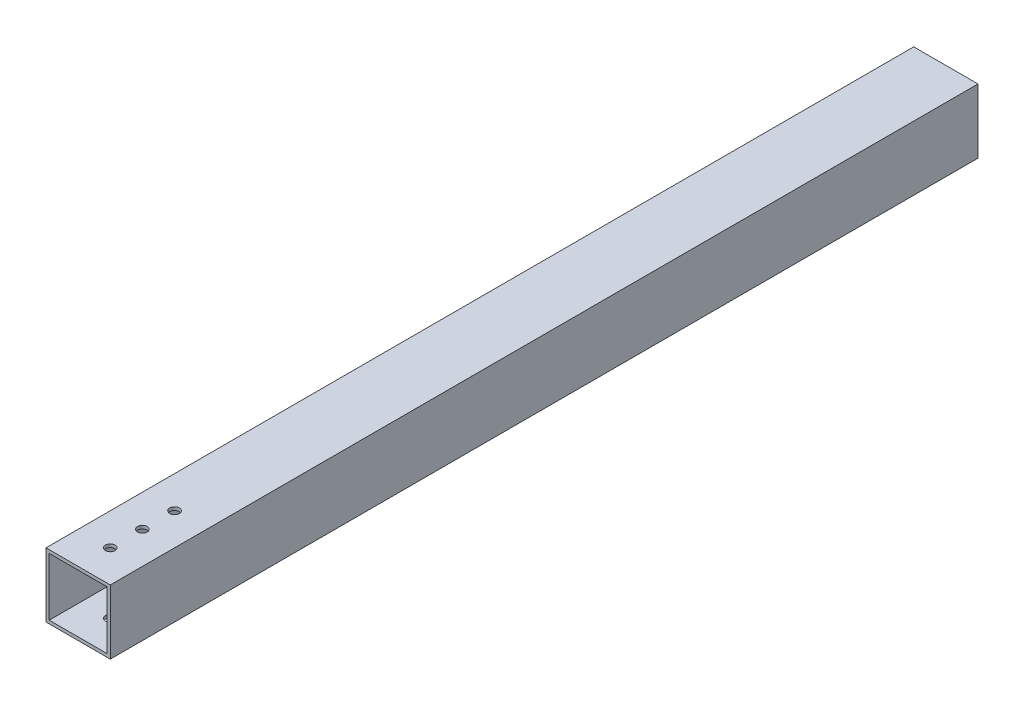
ISO-10303-21;
HEADER;
FILE_DESCRIPTION(('STEP AP214'),'2;1');
FILE_NAME('part.step','',(''),(''),'','','');
FILE_SCHEMA(('AUTOMOTIVE_DESIGN { 1 0 10303 214 1 1 1 1 }'));
ENDSEC;
DATA;
#1=APPLICATION_CONTEXT('core data for automotive mechanical design processes');
#2=APPLICATION_PROTOCOL_DEFINITION('international standard','automotive_design',2000,#1);
#3=PRODUCT_CONTEXT('',#1,'mechanical');
#4=PRODUCT('Part','Part','',(#3));
#5=PRODUCT_RELATED_PRODUCT_CATEGORY('part','',(#4));
#6=PRODUCT_DEFINITION_FORMATION('','',#4);
#7=PRODUCT_DEFINITION_CONTEXT('part definition',#1,'design');
#8=PRODUCT_DEFINITION('design','',#6,#7);
#9=PRODUCT_DEFINITION_SHAPE('','',#8);
#10=(LENGTH_UNIT() NAMED_UNIT(*) SI_UNIT(.MILLI.,.METRE.));
#11=(NAMED_UNIT(*) PLANE_ANGLE_UNIT() SI_UNIT($,.RADIAN.));
#12=(NAMED_UNIT(*) SI_UNIT($,.STERADIAN.) SOLID_ANGLE_UNIT());
#13=UNCERTAINTY_MEASURE_WITH_UNIT(LENGTH_MEASURE(1.E-05),#10,'distance_accuracy_value','');
#14=(GEOMETRIC_REPRESENTATION_CONTEXT(3) GLOBAL_UNCERTAINTY_ASSIGNED_CONTEXT((#13)) GLOBAL_UNIT_ASSIGNED_CONTEXT((#10,
#11,#12)) REPRESENTATION_CONTEXT('',''));
#15=CARTESIAN_POINT('',(0.,0.,0.));
#16=DIRECTION('',(0.,0.,1.));
#17=DIRECTION('',(1.,0.,0.));
#18=AXIS2_PLACEMENT_3D('',#15,#16,#17);
#19=CARTESIAN_POINT('',(0.,0.,135.));
#20=DIRECTION('',(0.,0.,1.));
#21=DIRECTION('',(1.,0.,0.));
#22=AXIS2_PLACEMENT_3D('',#19,#20,#21);
#23=PLANE('',#22);
#24=DIRECTION('',(0.,1.,0.));
#25=VECTOR('',#24,1.);
#26=CARTESIAN_POINT('',(10.,10.,135.));
#27=LINE('',#26,#25);
#28=CARTESIAN_POINT('',(10.,-10.,135.));
#29=VERTEX_POINT('',#28);
#30=CARTESIAN_POINT('',(10.,10.,135.));
#31=VERTEX_POINT('',#30);
#32=EDGE_CURVE('E163',#29,#31,#27,.T.);
#33=ORIENTED_EDGE('',*,*,#32,.T.);
#34=DIRECTION('',(-1.,0.,0.));
#35=VECTOR('',#34,1.);
#36=CARTESIAN_POINT('',(-10.,10.,135.));
#37=LINE('',#36,#35);
#38=CARTESIAN_POINT('',(-10.,10.,135.));
#39=VERTEX_POINT('',#38);
#40=EDGE_CURVE('E167',#31,#39,#37,.T.);
#41=ORIENTED_EDGE('',*,*,#40,.T.);
#42=DIRECTION('',(0.,-1.,0.));
#43=VECTOR('',#42,1.);
#44=CARTESIAN_POINT('',(-10.,10.,135.));
#45=LINE('',#44,#43);
#46=CARTESIAN_POINT('',(-10.,-10.,135.));
#47=VERTEX_POINT('',#46);
#48=EDGE_CURVE('E171',#39,#47,#45,.T.);
#49=ORIENTED_EDGE('',*,*,#48,.T.);
#50=DIRECTION('',(1.,0.,0.));
#51=VECTOR('',#50,1.);
#52=CARTESIAN_POINT('',(-10.,-10.,135.));
#53=LINE('',#52,#51);
#54=EDGE_CURVE('E174',#47,#29,#53,.T.);
#55=ORIENTED_EDGE('',*,*,#54,.T.);
#56=EDGE_LOOP('',(#33,#41,#49,#55));
#57=FACE_BOUND('',#56,.T.);
#58=DIRECTION('',(-1.,0.,0.));
#59=VECTOR('',#58,1.);
#60=CARTESIAN_POINT('',(-9.,9.,135.));
#61=LINE('',#60,#59);
#62=CARTESIAN_POINT('',(9.,9.,135.));
#63=VERTEX_POINT('',#62);
#64=CARTESIAN_POINT('',(-9.,9.,135.));
#65=VERTEX_POINT('',#64);
#66=EDGE_CURVE('E122',#63,#65,#61,.T.);
#67=ORIENTED_EDGE('',*,*,#66,.F.);
#68=DIRECTION('',(0.,1.,0.));
#69=VECTOR('',#68,1.);
#70=CARTESIAN_POINT('',(9.,9.,135.));
#71=LINE('',#70,#69);
#72=CARTESIAN_POINT('',(9.,-9.,135.));
#73=VERTEX_POINT('',#72);
#74=EDGE_CURVE('E113',#73,#63,#71,.T.);
#75=ORIENTED_EDGE('',*,*,#74,.F.);
#76=DIRECTION('',(1.,0.,0.));
#77=VECTOR('',#76,1.);
#78=CARTESIAN_POINT('',(-9.,-9.,135.));
#79=LINE('',#78,#77);
#80=CARTESIAN_POINT('',(-9.,-9.,135.));
#81=VERTEX_POINT('',#80);
#82=EDGE_CURVE('E139',#81,#73,#79,.T.);
#83=ORIENTED_EDGE('',*,*,#82,.F.);
#84=DIRECTION('',(0.,-1.,0.));
#85=VECTOR('',#84,1.);
#86=CARTESIAN_POINT('',(-9.,9.,135.));
#87=LINE('',#86,#85);
#88=EDGE_CURVE('E135',#65,#81,#87,.T.);
#89=ORIENTED_EDGE('',*,*,#88,.F.);
#90=EDGE_LOOP('',(#67,#75,#83,#89));
#91=FACE_BOUND('',#90,.T.);
#92=ADVANCED_FACE('F45',(#57,#91),#23,.T.);
#93=CARTESIAN_POINT('',(0.,0.,-135.));
#94=DIRECTION('',(0.,0.,1.));
#95=DIRECTION('',(1.,0.,0.));
#96=AXIS2_PLACEMENT_3D('',#93,#94,#95);
#97=PLANE('',#96);
#98=DIRECTION('',(0.,1.,0.));
#99=VECTOR('',#98,1.);
#100=CARTESIAN_POINT('',(10.,10.,-135.));
#101=LINE('',#100,#99);
#102=CARTESIAN_POINT('',(10.,-10.,-135.));
#103=VERTEX_POINT('',#102);
#104=CARTESIAN_POINT('',(10.,10.,-135.));
#105=VERTEX_POINT('',#104);
#106=EDGE_CURVE('E131',#103,#105,#101,.T.);
#107=ORIENTED_EDGE('',*,*,#106,.F.);
#108=DIRECTION('',(1.,0.,0.));
#109=VECTOR('',#108,1.);
#110=CARTESIAN_POINT('',(-10.,-10.,-135.));
#111=LINE('',#110,#109);
#112=CARTESIAN_POINT('',(-10.,-10.,-135.));
#113=VERTEX_POINT('',#112);
#114=EDGE_CURVE('E168',#113,#103,#111,.T.);
#115=ORIENTED_EDGE('',*,*,#114,.F.);
#116=DIRECTION('',(0.,-1.,0.));
#117=VECTOR('',#116,1.);
#118=CARTESIAN_POINT('',(-10.,10.,-135.));
#119=LINE('',#118,#117);
#120=CARTESIAN_POINT('',(-10.,10.,-135.));
#121=VERTEX_POINT('',#120);
#122=EDGE_CURVE('E184',#121,#113,#119,.T.);
#123=ORIENTED_EDGE('',*,*,#122,.F.);
#124=DIRECTION('',(-1.,0.,0.));
#125=VECTOR('',#124,1.);
#126=CARTESIAN_POINT('',(-10.,10.,-135.));
#127=LINE('',#126,#125);
#128=EDGE_CURVE('E181',#105,#121,#127,.T.);
#129=ORIENTED_EDGE('',*,*,#128,.F.);
#130=EDGE_LOOP('',(#107,#115,#123,#129));
#131=FACE_BOUND('',#130,.T.);
#132=DIRECTION('',(0.,1.,0.));
#133=VECTOR('',#132,1.);
#134=CARTESIAN_POINT('',(9.,9.,-135.));
#135=LINE('',#134,#133);
#136=CARTESIAN_POINT('',(9.,-9.,-135.));
#137=VERTEX_POINT('',#136);
#138=CARTESIAN_POINT('',(9.,9.,-135.));
#139=VERTEX_POINT('',#138);
#140=EDGE_CURVE('E71',#137,#139,#135,.T.);
#141=ORIENTED_EDGE('',*,*,#140,.T.);
#142=DIRECTION('',(-1.,0.,0.));
#143=VECTOR('',#142,1.);
#144=CARTESIAN_POINT('',(-9.,9.,-135.));
#145=LINE('',#144,#143);
#146=CARTESIAN_POINT('',(-9.,9.,-135.));
#147=VERTEX_POINT('',#146);
#148=EDGE_CURVE('E129',#139,#147,#145,.T.);
#149=ORIENTED_EDGE('',*,*,#148,.T.);
#150=DIRECTION('',(0.,-1.,0.));
#151=VECTOR('',#150,1.);
#152=CARTESIAN_POINT('',(-9.,9.,-135.));
#153=LINE('',#152,#151);
#154=CARTESIAN_POINT('',(-9.,-9.,-135.));
#155=VERTEX_POINT('',#154);
#156=EDGE_CURVE('E150',#147,#155,#153,.T.);
#157=ORIENTED_EDGE('',*,*,#156,.T.);
#158=DIRECTION('',(1.,0.,0.));
#159=VECTOR('',#158,1.);
#160=CARTESIAN_POINT('',(-9.,-9.,-135.));
#161=LINE('',#160,#159);
#162=EDGE_CURVE('E123',#155,#137,#161,.T.);
#163=ORIENTED_EDGE('',*,*,#162,.T.);
#164=EDGE_LOOP('',(#141,#149,#157,#163));
#165=FACE_BOUND('',#164,.T.);
#166=ADVANCED_FACE('F258',(#131,#165),#97,.F.);
#167=CARTESIAN_POINT('',(10.,10.,135.));
#168=DIRECTION('',(-1.,0.,0.));
#169=DIRECTION('',(0.,0.,1.));
#170=AXIS2_PLACEMENT_3D('',#167,#168,#169);
#171=PLANE('',#170);
#172=ORIENTED_EDGE('',*,*,#106,.T.);
#173=DIRECTION('',(0.,0.,-1.));
#174=VECTOR('',#173,1.);
#175=CARTESIAN_POINT('',(10.,10.,135.));
#176=LINE('',#175,#174);
#177=EDGE_CURVE('E11',#31,#105,#176,.T.);
#178=ORIENTED_EDGE('',*,*,#177,.F.);
#179=ORIENTED_EDGE('',*,*,#32,.F.);
#180=DIRECTION('',(0.,0.,-1.));
#181=VECTOR('',#180,1.);
#182=CARTESIAN_POINT('',(10.,-10.,135.));
#183=LINE('',#182,#181);
#184=EDGE_CURVE('E177',#29,#103,#183,.T.);
#185=ORIENTED_EDGE('',*,*,#184,.T.);
#186=EDGE_LOOP('',(#172,#178,#179,#185));
#187=FACE_BOUND('',#186,.T.);
#188=ADVANCED_FACE('F47',(#187),#171,.F.);
#189=CARTESIAN_POINT('',(-10.,10.,135.));
#190=DIRECTION('',(0.,-1.,0.));
#191=DIRECTION('',(0.,0.,-1.));
#192=AXIS2_PLACEMENT_3D('',#189,#190,#191);
#193=PLANE('',#192);
#194=CARTESIAN_POINT('',(0.,10.,125.));
#195=DIRECTION('',(0.,1.,0.));
#196=DIRECTION('',(0.,0.,1.));
#197=AXIS2_PLACEMENT_3D('',#194,#195,#196);
#198=CIRCLE('',#197,1.5);
#199=CARTESIAN_POINT('',(0.,10.,126.5));
#200=VERTEX_POINT('',#199);
#201=EDGE_CURVE('E203',#200,#200,#198,.T.);
#202=ORIENTED_EDGE('',*,*,#201,.F.);
#203=EDGE_LOOP('',(#202));
#204=FACE_BOUND('',#203,.T.);
#205=CARTESIAN_POINT('',(0.,10.,115.));
#206=DIRECTION('',(0.,1.,0.));
#207=DIRECTION('',(0.,0.,1.));
#208=AXIS2_PLACEMENT_3D('',#205,#206,#207);
#209=CIRCLE('',#208,1.5);
#210=CARTESIAN_POINT('',(0.,10.,116.5));
#211=VERTEX_POINT('',#210);
#212=EDGE_CURVE('E288',#211,#211,#209,.T.);
#213=ORIENTED_EDGE('',*,*,#212,.F.);
#214=EDGE_LOOP('',(#213));
#215=FACE_BOUND('',#214,.T.);
#216=CARTESIAN_POINT('',(0.,10.,105.));
#217=DIRECTION('',(0.,1.,0.));
#218=DIRECTION('',(0.,0.,1.));
#219=AXIS2_PLACEMENT_3D('',#216,#217,#218);
#220=CIRCLE('',#219,1.5);
#221=CARTESIAN_POINT('',(0.,10.,106.5));
#222=VERTEX_POINT('',#221);
#223=EDGE_CURVE('E292',#222,#222,#220,.T.);
#224=ORIENTED_EDGE('',*,*,#223,.F.);
#225=EDGE_LOOP('',(#224));
#226=FACE_BOUND('',#225,.T.);
#227=ORIENTED_EDGE('',*,*,#128,.T.);
#228=DIRECTION('',(0.,0.,-1.));
#229=VECTOR('',#228,1.);
#230=CARTESIAN_POINT('',(-10.,10.,135.));
#231=LINE('',#230,#229);
#232=EDGE_CURVE('E55',#39,#121,#231,.T.);
#233=ORIENTED_EDGE('',*,*,#232,.F.);
#234=ORIENTED_EDGE('',*,*,#40,.F.);
#235=ORIENTED_EDGE('',*,*,#177,.T.);
#236=EDGE_LOOP('',(#227,#233,#234,#235));
#237=FACE_BOUND('',#236,.T.);
#238=ADVANCED_FACE('F273',(#204,#215,#226,#237),#193,.F.);
#239=CARTESIAN_POINT('',(-10.,10.,135.));
#240=DIRECTION('',(1.,0.,0.));
#241=DIRECTION('',(0.,0.,-1.));
#242=AXIS2_PLACEMENT_3D('',#239,#240,#241);
#243=PLANE('',#242);
#244=ORIENTED_EDGE('',*,*,#122,.T.);
#245=DIRECTION('',(0.,0.,-1.));
#246=VECTOR('',#245,1.);
#247=CARTESIAN_POINT('',(-10.,-10.,135.));
#248=LINE('',#247,#246);
#249=EDGE_CURVE('E192',#47,#113,#248,.T.);
#250=ORIENTED_EDGE('',*,*,#249,.F.);
#251=ORIENTED_EDGE('',*,*,#48,.F.);
#252=ORIENTED_EDGE('',*,*,#232,.T.);
#253=EDGE_LOOP('',(#244,#250,#251,#252));
#254=FACE_BOUND('',#253,.T.);
#255=ADVANCED_FACE('F271',(#254),#243,.F.);
#256=CARTESIAN_POINT('',(-10.,-10.,135.));
#257=DIRECTION('',(0.,1.,0.));
#258=DIRECTION('',(0.,0.,1.));
#259=AXIS2_PLACEMENT_3D('',#256,#257,#258);
#260=PLANE('',#259);
#261=CARTESIAN_POINT('',(0.,-9.99999999999999,125.));
#262=DIRECTION('',(0.,1.,0.));
#263=DIRECTION('',(0.,0.,1.));
#264=AXIS2_PLACEMENT_3D('',#261,#262,#263);
#265=CIRCLE('',#264,1.5);
#266=CARTESIAN_POINT('',(0.,-9.99999999999999,126.5));
#267=VERTEX_POINT('',#266);
#268=EDGE_CURVE('E147',#267,#267,#265,.T.);
#269=ORIENTED_EDGE('',*,*,#268,.T.);
#270=EDGE_LOOP('',(#269));
#271=FACE_BOUND('',#270,.T.);
#272=CARTESIAN_POINT('',(0.,-9.99999999999999,115.));
#273=DIRECTION('',(0.,1.,0.));
#274=DIRECTION('',(0.,0.,1.));
#275=AXIS2_PLACEMENT_3D('',#272,#273,#274);
#276=CIRCLE('',#275,1.5);
#277=CARTESIAN_POINT('',(0.,-9.99999999999999,116.5));
#278=VERTEX_POINT('',#277);
#279=EDGE_CURVE('E214',#278,#278,#276,.T.);
#280=ORIENTED_EDGE('',*,*,#279,.T.);
#281=EDGE_LOOP('',(#280));
#282=FACE_BOUND('',#281,.T.);
#283=CARTESIAN_POINT('',(0.,-9.99999999999999,105.));
#284=DIRECTION('',(0.,1.,0.));
#285=DIRECTION('',(0.,0.,1.));
#286=AXIS2_PLACEMENT_3D('',#283,#284,#285);
#287=CIRCLE('',#286,1.5);
#288=CARTESIAN_POINT('',(0.,-9.99999999999999,106.5));
#289=VERTEX_POINT('',#288);
#290=EDGE_CURVE('E208',#289,#289,#287,.T.);
#291=ORIENTED_EDGE('',*,*,#290,.T.);
#292=EDGE_LOOP('',(#291));
#293=FACE_BOUND('',#292,.T.);
#294=ORIENTED_EDGE('',*,*,#114,.T.);
#295=ORIENTED_EDGE('',*,*,#184,.F.);
#296=ORIENTED_EDGE('',*,*,#54,.F.);
#297=ORIENTED_EDGE('',*,*,#249,.T.);
#298=EDGE_LOOP('',(#294,#295,#296,#297));
#299=FACE_BOUND('',#298,.T.);
#300=ADVANCED_FACE('F235',(#271,#282,#293,#299),#260,.F.);
#301=CARTESIAN_POINT('',(9.,9.,135.));
#302=DIRECTION('',(-1.,0.,0.));
#303=DIRECTION('',(0.,0.,1.));
#304=AXIS2_PLACEMENT_3D('',#301,#302,#303);
#305=PLANE('',#304);
#306=ORIENTED_EDGE('',*,*,#140,.F.);
#307=DIRECTION('',(0.,0.,-1.));
#308=VECTOR('',#307,1.);
#309=CARTESIAN_POINT('',(9.,-9.,135.));
#310=LINE('',#309,#308);
#311=EDGE_CURVE('E117',#73,#137,#310,.T.);
#312=ORIENTED_EDGE('',*,*,#311,.F.);
#313=ORIENTED_EDGE('',*,*,#74,.T.);
#314=DIRECTION('',(0.,0.,-1.));
#315=VECTOR('',#314,1.);
#316=CARTESIAN_POINT('',(9.,9.,135.));
#317=LINE('',#316,#315);
#318=EDGE_CURVE('E116',#63,#139,#317,.T.);
#319=ORIENTED_EDGE('',*,*,#318,.T.);
#320=EDGE_LOOP('',(#306,#312,#313,#319));
#321=FACE_BOUND('',#320,.T.);
#322=ADVANCED_FACE('F115',(#321),#305,.T.);
#323=CARTESIAN_POINT('',(-9.,9.,135.));
#324=DIRECTION('',(0.,-1.,0.));
#325=DIRECTION('',(0.,0.,-1.));
#326=AXIS2_PLACEMENT_3D('',#323,#324,#325);
#327=PLANE('',#326);
#328=CARTESIAN_POINT('',(0.,8.99999999999999,125.));
#329=DIRECTION('',(0.,-1.,0.));
#330=DIRECTION('',(0.,0.,-1.));
#331=AXIS2_PLACEMENT_3D('',#328,#329,#330);
#332=CIRCLE('',#331,1.5);
#333=CARTESIAN_POINT('',(0.,8.99999999999999,123.5));
#334=VERTEX_POINT('',#333);
#335=EDGE_CURVE('E228',#334,#334,#332,.T.);
#336=ORIENTED_EDGE('',*,*,#335,.F.);
#337=EDGE_LOOP('',(#336));
#338=FACE_BOUND('',#337,.T.);
#339=CARTESIAN_POINT('',(0.,8.99999999999999,115.));
#340=DIRECTION('',(0.,-1.,0.));
#341=DIRECTION('',(0.,0.,-1.));
#342=AXIS2_PLACEMENT_3D('',#339,#340,#341);
#343=CIRCLE('',#342,1.5);
#344=CARTESIAN_POINT('',(0.,8.99999999999999,113.5));
#345=VERTEX_POINT('',#344);
#346=EDGE_CURVE('E207',#345,#345,#343,.T.);
#347=ORIENTED_EDGE('',*,*,#346,.F.);
#348=EDGE_LOOP('',(#347));
#349=FACE_BOUND('',#348,.T.);
#350=CARTESIAN_POINT('',(0.,8.99999999999999,105.));
#351=DIRECTION('',(0.,-1.,0.));
#352=DIRECTION('',(0.,0.,-1.));
#353=AXIS2_PLACEMENT_3D('',#350,#351,#352);
#354=CIRCLE('',#353,1.5);
#355=CARTESIAN_POINT('',(0.,8.99999999999999,103.5));
#356=VERTEX_POINT('',#355);
#357=EDGE_CURVE('E202',#356,#356,#354,.T.);
#358=ORIENTED_EDGE('',*,*,#357,.F.);
#359=EDGE_LOOP('',(#358));
#360=FACE_BOUND('',#359,.T.);
#361=ORIENTED_EDGE('',*,*,#148,.F.);
#362=ORIENTED_EDGE('',*,*,#318,.F.);
#363=ORIENTED_EDGE('',*,*,#66,.T.);
#364=DIRECTION('',(0.,0.,-1.));
#365=VECTOR('',#364,1.);
#366=CARTESIAN_POINT('',(-9.,9.,135.));
#367=LINE('',#366,#365);
#368=EDGE_CURVE('E132',#65,#147,#367,.T.);
#369=ORIENTED_EDGE('',*,*,#368,.T.);
#370=EDGE_LOOP('',(#361,#362,#363,#369));
#371=FACE_BOUND('',#370,.T.);
#372=ADVANCED_FACE('F126',(#338,#349,#360,#371),#327,.T.);
#373=CARTESIAN_POINT('',(-9.,9.,135.));
#374=DIRECTION('',(1.,0.,0.));
#375=DIRECTION('',(0.,0.,-1.));
#376=AXIS2_PLACEMENT_3D('',#373,#374,#375);
#377=PLANE('',#376);
#378=ORIENTED_EDGE('',*,*,#156,.F.);
#379=ORIENTED_EDGE('',*,*,#368,.F.);
#380=ORIENTED_EDGE('',*,*,#88,.T.);
#381=DIRECTION('',(0.,0.,-1.));
#382=VECTOR('',#381,1.);
#383=CARTESIAN_POINT('',(-9.,-9.,135.));
#384=LINE('',#383,#382);
#385=EDGE_CURVE('E63',#81,#155,#384,.T.);
#386=ORIENTED_EDGE('',*,*,#385,.T.);
#387=EDGE_LOOP('',(#378,#379,#380,#386));
#388=FACE_BOUND('',#387,.T.);
#389=ADVANCED_FACE('F308',(#388),#377,.T.);
#390=CARTESIAN_POINT('',(-9.,-9.,135.));
#391=DIRECTION('',(0.,1.,0.));
#392=DIRECTION('',(0.,0.,1.));
#393=AXIS2_PLACEMENT_3D('',#390,#391,#392);
#394=PLANE('',#393);
#395=CARTESIAN_POINT('',(0.,-8.99999999999999,125.));
#396=DIRECTION('',(0.,1.,0.));
#397=DIRECTION('',(0.,0.,1.));
#398=AXIS2_PLACEMENT_3D('',#395,#396,#397);
#399=CIRCLE('',#398,1.5);
#400=CARTESIAN_POINT('',(0.,-8.99999999999999,126.5));
#401=VERTEX_POINT('',#400);
#402=EDGE_CURVE('E49',#401,#401,#399,.T.);
#403=ORIENTED_EDGE('',*,*,#402,.F.);
#404=EDGE_LOOP('',(#403));
#405=FACE_BOUND('',#404,.T.);
#406=CARTESIAN_POINT('',(0.,-8.99999999999999,115.));
#407=DIRECTION('',(0.,1.,0.));
#408=DIRECTION('',(0.,0.,1.));
#409=AXIS2_PLACEMENT_3D('',#406,#407,#408);
#410=CIRCLE('',#409,1.5);
#411=CARTESIAN_POINT('',(0.,-8.99999999999999,116.5));
#412=VERTEX_POINT('',#411);
#413=EDGE_CURVE('E204',#412,#412,#410,.T.);
#414=ORIENTED_EDGE('',*,*,#413,.F.);
#415=EDGE_LOOP('',(#414));
#416=FACE_BOUND('',#415,.T.);
#417=CARTESIAN_POINT('',(0.,-8.99999999999999,105.));
#418=DIRECTION('',(0.,1.,0.));
#419=DIRECTION('',(0.,0.,1.));
#420=AXIS2_PLACEMENT_3D('',#417,#418,#419);
#421=CIRCLE('',#420,1.5);
#422=CARTESIAN_POINT('',(0.,-8.99999999999999,106.5));
#423=VERTEX_POINT('',#422);
#424=EDGE_CURVE('E199',#423,#423,#421,.T.);
#425=ORIENTED_EDGE('',*,*,#424,.F.);
#426=EDGE_LOOP('',(#425));
#427=FACE_BOUND('',#426,.T.);
#428=ORIENTED_EDGE('',*,*,#162,.F.);
#429=ORIENTED_EDGE('',*,*,#385,.F.);
#430=ORIENTED_EDGE('',*,*,#82,.T.);
#431=ORIENTED_EDGE('',*,*,#311,.T.);
#432=EDGE_LOOP('',(#428,#429,#430,#431));
#433=FACE_BOUND('',#432,.T.);
#434=ADVANCED_FACE('F306',(#405,#416,#427,#433),#394,.T.);
#435=CARTESIAN_POINT('',(0.,-90.,105.));
#436=DIRECTION('',(0.,1.,0.));
#437=DIRECTION('',(0.,0.,1.));
#438=AXIS2_PLACEMENT_3D('',#435,#436,#437);
#439=CYLINDRICAL_SURFACE('',#438,1.5);
#440=ORIENTED_EDGE('',*,*,#424,.T.);
#441=EDGE_LOOP('',(#440));
#442=FACE_BOUND('',#441,.T.);
#443=ORIENTED_EDGE('',*,*,#290,.F.);
#444=EDGE_LOOP('',(#443));
#445=FACE_BOUND('',#444,.T.);
#446=ADVANCED_FACE('F252',(#442,#445),#439,.F.);
#447=CARTESIAN_POINT('',(0.,-90.,115.));
#448=DIRECTION('',(0.,1.,0.));
#449=DIRECTION('',(0.,0.,1.));
#450=AXIS2_PLACEMENT_3D('',#447,#448,#449);
#451=CYLINDRICAL_SURFACE('',#450,1.5);
#452=ORIENTED_EDGE('',*,*,#413,.T.);
#453=EDGE_LOOP('',(#452));
#454=FACE_BOUND('',#453,.T.);
#455=ORIENTED_EDGE('',*,*,#279,.F.);
#456=EDGE_LOOP('',(#455));
#457=FACE_BOUND('',#456,.T.);
#458=ADVANCED_FACE('F241',(#454,#457),#451,.F.);
#459=CARTESIAN_POINT('',(0.,-90.,125.));
#460=DIRECTION('',(0.,1.,0.));
#461=DIRECTION('',(0.,0.,1.));
#462=AXIS2_PLACEMENT_3D('',#459,#460,#461);
#463=CYLINDRICAL_SURFACE('',#462,1.5);
#464=ORIENTED_EDGE('',*,*,#402,.T.);
#465=EDGE_LOOP('',(#464));
#466=FACE_BOUND('',#465,.T.);
#467=ORIENTED_EDGE('',*,*,#268,.F.);
#468=EDGE_LOOP('',(#467));
#469=FACE_BOUND('',#468,.T.);
#470=ADVANCED_FACE('F238',(#466,#469),#463,.F.);
#471=ORIENTED_EDGE('',*,*,#357,.T.);
#472=EDGE_LOOP('',(#471));
#473=FACE_BOUND('',#472,.T.);
#474=ORIENTED_EDGE('',*,*,#223,.T.);
#475=EDGE_LOOP('',(#474));
#476=FACE_BOUND('',#475,.T.);
#477=ADVANCED_FACE('F240',(#473,#476),#439,.F.);
#478=ORIENTED_EDGE('',*,*,#346,.T.);
#479=EDGE_LOOP('',(#478));
#480=FACE_BOUND('',#479,.T.);
#481=ORIENTED_EDGE('',*,*,#212,.T.);
#482=EDGE_LOOP('',(#481));
#483=FACE_BOUND('',#482,.T.);
#484=ADVANCED_FACE('F249',(#480,#483),#451,.F.);
#485=ORIENTED_EDGE('',*,*,#335,.T.);
#486=EDGE_LOOP('',(#485));
#487=FACE_BOUND('',#486,.T.);
#488=ORIENTED_EDGE('',*,*,#201,.T.);
#489=EDGE_LOOP('',(#488));
#490=FACE_BOUND('',#489,.T.);
#491=ADVANCED_FACE('F244',(#487,#490),#463,.F.);
#492=CLOSED_SHELL('',(#92,#166,#188,#238,#255,#300,#322,#372,#389,#434,#446,#458,#470,#477,#484,#491));
#493=MANIFOLD_SOLID_BREP('B2',#492);
#494=ADVANCED_BREP_SHAPE_REPRESENTATION('',(#18,#493),#14);
#495=SHAPE_DEFINITION_REPRESENTATION(#9,#494);
ENDSEC;
END-ISO-10303-21;
